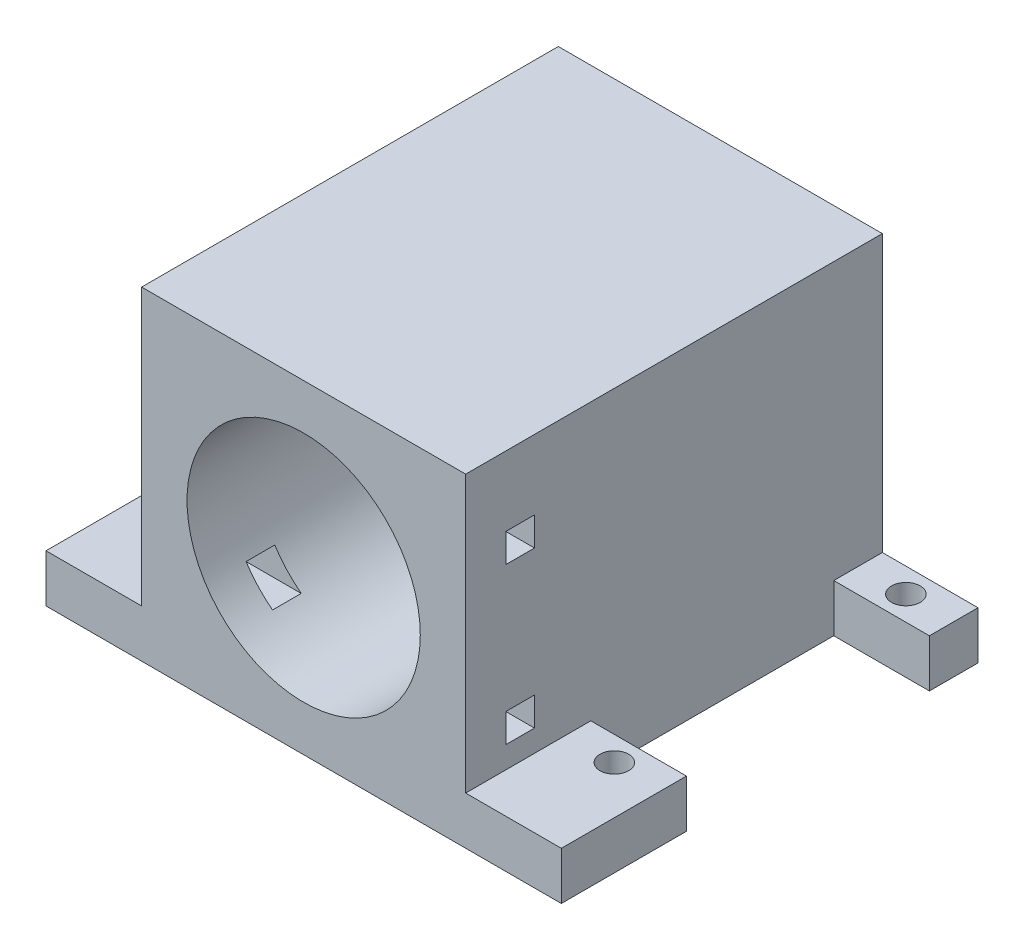
ISO-10303-21;
HEADER;
FILE_DESCRIPTION(('STEP AP214'),'2;1');
FILE_NAME('part.step','',(''),(''),'','','');
FILE_SCHEMA(('AUTOMOTIVE_DESIGN { 1 0 10303 214 1 1 1 1 }'));
ENDSEC;
DATA;
#1=APPLICATION_CONTEXT('core data for automotive mechanical design processes');
#2=APPLICATION_PROTOCOL_DEFINITION('international standard','automotive_design',2000,#1);
#3=PRODUCT_CONTEXT('',#1,'mechanical');
#4=PRODUCT('Part','Part','',(#3));
#5=PRODUCT_RELATED_PRODUCT_CATEGORY('part','',(#4));
#6=PRODUCT_DEFINITION_FORMATION('','',#4);
#7=PRODUCT_DEFINITION_CONTEXT('part definition',#1,'design');
#8=PRODUCT_DEFINITION('design','',#6,#7);
#9=PRODUCT_DEFINITION_SHAPE('','',#8);
#10=(LENGTH_UNIT() NAMED_UNIT(*) SI_UNIT(.MILLI.,.METRE.));
#11=(NAMED_UNIT(*) PLANE_ANGLE_UNIT() SI_UNIT($,.RADIAN.));
#12=(NAMED_UNIT(*) SI_UNIT($,.STERADIAN.) SOLID_ANGLE_UNIT());
#13=UNCERTAINTY_MEASURE_WITH_UNIT(LENGTH_MEASURE(1.E-05),#10,'distance_accuracy_value','');
#14=(GEOMETRIC_REPRESENTATION_CONTEXT(3) GLOBAL_UNCERTAINTY_ASSIGNED_CONTEXT((#13)) GLOBAL_UNIT_ASSIGNED_CONTEXT((#10,
#11,#12)) REPRESENTATION_CONTEXT('',''));
#15=CARTESIAN_POINT('',(0.,0.,0.));
#16=DIRECTION('',(0.,0.,1.));
#17=DIRECTION('',(1.,0.,0.));
#18=AXIS2_PLACEMENT_3D('',#15,#16,#17);
#19=CARTESIAN_POINT('',(0.,-11.938,17.78));
#20=DIRECTION('',(0.,1.,0.));
#21=DIRECTION('',(0.,0.,1.));
#22=AXIS2_PLACEMENT_3D('',#19,#20,#21);
#23=PLANE('',#22);
#24=CARTESIAN_POINT('',(-21.938,-11.938,-15.24));
#25=DIRECTION('',(0.,1.,0.));
#26=DIRECTION('',(0.,0.,1.));
#27=AXIS2_PLACEMENT_3D('',#24,#25,#26);
#28=CIRCLE('',#27,1.5);
#29=CARTESIAN_POINT('',(-21.938,-11.938,-13.74));
#30=VERTEX_POINT('',#29);
#31=EDGE_CURVE('E375',#30,#30,#28,.T.);
#32=ORIENTED_EDGE('',*,*,#31,.F.);
#33=EDGE_LOOP('',(#32));
#34=FACE_BOUND('',#33,.T.);
#35=DIRECTION('',(-1.,0.,0.));
#36=VECTOR('',#35,1.);
#37=CARTESIAN_POINT('',(-26.938,-11.938,-12.7));
#38=LINE('',#37,#36);
#39=CARTESIAN_POINT('',(-16.938,-11.938,-12.7));
#40=VERTEX_POINT('',#39);
#41=CARTESIAN_POINT('',(-26.938,-11.938,-12.7));
#42=VERTEX_POINT('',#41);
#43=EDGE_CURVE('E408',#40,#42,#38,.T.);
#44=ORIENTED_EDGE('',*,*,#43,.F.);
#45=DIRECTION('',(0.,0.,-1.));
#46=VECTOR('',#45,1.);
#47=CARTESIAN_POINT('',(-16.938,-11.938,17.78));
#48=LINE('',#47,#46);
#49=CARTESIAN_POINT('',(-16.938,-11.938,-17.78));
#50=VERTEX_POINT('',#49);
#51=EDGE_CURVE('E473',#40,#50,#48,.T.);
#52=ORIENTED_EDGE('',*,*,#51,.T.);
#53=DIRECTION('',(1.,0.,0.));
#54=VECTOR('',#53,1.);
#55=CARTESIAN_POINT('',(0.,-11.938,-17.78));
#56=LINE('',#55,#54);
#57=CARTESIAN_POINT('',(-26.938,-11.938,-17.78));
#58=VERTEX_POINT('',#57);
#59=EDGE_CURVE('E438',#58,#50,#56,.T.);
#60=ORIENTED_EDGE('',*,*,#59,.F.);
#61=DIRECTION('',(0.,0.,-1.));
#62=VECTOR('',#61,1.);
#63=CARTESIAN_POINT('',(-26.938,-11.938,17.78));
#64=LINE('',#63,#62);
#65=EDGE_CURVE('E469',#42,#58,#64,.T.);
#66=ORIENTED_EDGE('',*,*,#65,.F.);
#67=EDGE_LOOP('',(#44,#52,#60,#66));
#68=FACE_BOUND('',#67,.T.);
#69=ADVANCED_FACE('F36',(#34,#68),#23,.T.);
#70=CARTESIAN_POINT('',(-26.938,0.,17.78));
#71=DIRECTION('',(-1.,0.,0.));
#72=DIRECTION('',(0.,0.,1.));
#73=AXIS2_PLACEMENT_3D('',#70,#71,#72);
#74=PLANE('',#73);
#75=DIRECTION('',(0.,1.,0.));
#76=VECTOR('',#75,1.);
#77=CARTESIAN_POINT('',(-26.938,-16.939,-12.7));
#78=LINE('',#77,#76);
#79=CARTESIAN_POINT('',(-26.938,-16.938,-12.7));
#80=VERTEX_POINT('',#79);
#81=EDGE_CURVE('E411',#80,#42,#78,.T.);
#82=ORIENTED_EDGE('',*,*,#81,.T.);
#83=ORIENTED_EDGE('',*,*,#65,.T.);
#84=DIRECTION('',(0.,1.,0.));
#85=VECTOR('',#84,1.);
#86=CARTESIAN_POINT('',(-26.938,0.,-17.78));
#87=LINE('',#86,#85);
#88=CARTESIAN_POINT('',(-26.938,-16.938,-17.78));
#89=VERTEX_POINT('',#88);
#90=EDGE_CURVE('E441',#89,#58,#87,.T.);
#91=ORIENTED_EDGE('',*,*,#90,.F.);
#92=DIRECTION('',(0.,0.,-1.));
#93=VECTOR('',#92,1.);
#94=CARTESIAN_POINT('',(-26.938,-16.938,17.78));
#95=LINE('',#94,#93);
#96=EDGE_CURVE('E465',#80,#89,#95,.T.);
#97=ORIENTED_EDGE('',*,*,#96,.F.);
#98=EDGE_LOOP('',(#82,#83,#91,#97));
#99=FACE_BOUND('',#98,.T.);
#100=ADVANCED_FACE('F540',(#99),#74,.T.);
#101=CARTESIAN_POINT('',(26.938,0.,17.78));
#102=DIRECTION('',(1.,0.,0.));
#103=DIRECTION('',(0.,0.,-1.));
#104=AXIS2_PLACEMENT_3D('',#101,#102,#103);
#105=PLANE('',#104);
#106=DIRECTION('',(0.,1.,0.));
#107=VECTOR('',#106,1.);
#108=CARTESIAN_POINT('',(26.938,-16.939,-12.7));
#109=LINE('',#108,#107);
#110=CARTESIAN_POINT('',(26.938,-16.938,-12.7));
#111=VERTEX_POINT('',#110);
#112=CARTESIAN_POINT('',(26.938,-11.938,-12.7));
#113=VERTEX_POINT('',#112);
#114=EDGE_CURVE('E387',#111,#113,#109,.T.);
#115=ORIENTED_EDGE('',*,*,#114,.F.);
#116=DIRECTION('',(0.,0.,-1.));
#117=VECTOR('',#116,1.);
#118=CARTESIAN_POINT('',(26.938,-16.938,17.78));
#119=LINE('',#118,#117);
#120=CARTESIAN_POINT('',(26.938,-16.938,-17.78));
#121=VERTEX_POINT('',#120);
#122=EDGE_CURVE('E461',#111,#121,#119,.T.);
#123=ORIENTED_EDGE('',*,*,#122,.T.);
#124=DIRECTION('',(0.,-1.,0.));
#125=VECTOR('',#124,1.);
#126=CARTESIAN_POINT('',(26.938,0.,-17.78));
#127=LINE('',#126,#125);
#128=CARTESIAN_POINT('',(26.938,-11.938,-17.78));
#129=VERTEX_POINT('',#128);
#130=EDGE_CURVE('E447',#129,#121,#127,.T.);
#131=ORIENTED_EDGE('',*,*,#130,.F.);
#132=DIRECTION('',(0.,0.,-1.));
#133=VECTOR('',#132,1.);
#134=CARTESIAN_POINT('',(26.938,-11.938,17.78));
#135=LINE('',#134,#133);
#136=EDGE_CURVE('E457',#113,#129,#135,.T.);
#137=ORIENTED_EDGE('',*,*,#136,.F.);
#138=EDGE_LOOP('',(#115,#123,#131,#137));
#139=FACE_BOUND('',#138,.T.);
#140=ADVANCED_FACE('F547',(#139),#105,.T.);
#141=CARTESIAN_POINT('',(0.,-11.938,17.78));
#142=DIRECTION('',(0.,1.,0.));
#143=DIRECTION('',(0.,0.,1.));
#144=AXIS2_PLACEMENT_3D('',#141,#142,#143);
#145=PLANE('',#144);
#146=CARTESIAN_POINT('',(21.938,-11.938,-15.24));
#147=DIRECTION('',(0.,1.,0.));
#148=DIRECTION('',(0.,0.,-1.));
#149=AXIS2_PLACEMENT_3D('',#146,#147,#148);
#150=CIRCLE('',#149,1.5);
#151=CARTESIAN_POINT('',(21.938,-11.938,-16.74));
#152=VERTEX_POINT('',#151);
#153=EDGE_CURVE('E359',#152,#152,#150,.T.);
#154=ORIENTED_EDGE('',*,*,#153,.F.);
#155=EDGE_LOOP('',(#154));
#156=FACE_BOUND('',#155,.T.);
#157=DIRECTION('',(-1.,0.,0.));
#158=VECTOR('',#157,1.);
#159=CARTESIAN_POINT('',(16.938,-11.938,-12.7));
#160=LINE('',#159,#158);
#161=CARTESIAN_POINT('',(16.938,-11.938,-12.7));
#162=VERTEX_POINT('',#161);
#163=EDGE_CURVE('E380',#113,#162,#160,.T.);
#164=ORIENTED_EDGE('',*,*,#163,.F.);
#165=ORIENTED_EDGE('',*,*,#136,.T.);
#166=DIRECTION('',(1.,0.,0.));
#167=VECTOR('',#166,1.);
#168=CARTESIAN_POINT('',(0.,-11.938,-17.78));
#169=LINE('',#168,#167);
#170=CARTESIAN_POINT('',(16.938,-11.938,-17.78));
#171=VERTEX_POINT('',#170);
#172=EDGE_CURVE('E450',#171,#129,#169,.T.);
#173=ORIENTED_EDGE('',*,*,#172,.F.);
#174=DIRECTION('',(0.,0.,-1.));
#175=VECTOR('',#174,1.);
#176=CARTESIAN_POINT('',(16.938,-11.938,17.78));
#177=LINE('',#176,#175);
#178=EDGE_CURVE('E453',#162,#171,#177,.T.);
#179=ORIENTED_EDGE('',*,*,#178,.F.);
#180=EDGE_LOOP('',(#164,#165,#173,#179));
#181=FACE_BOUND('',#180,.T.);
#182=ADVANCED_FACE('F617',(#156,#181),#145,.T.);
#183=CARTESIAN_POINT('',(0.,0.,17.78));
#184=DIRECTION('',(0.,0.,-1.));
#185=DIRECTION('',(-1.,0.,0.));
#186=AXIS2_PLACEMENT_3D('',#183,#184,#185);
#187=CYLINDRICAL_SURFACE('',#186,3.5);
#188=CARTESIAN_POINT('',(0.,0.,-17.78));
#189=DIRECTION('',(0.,0.,1.));
#190=DIRECTION('',(1.,0.,0.));
#191=AXIS2_PLACEMENT_3D('',#188,#189,#190);
#192=CIRCLE('',#191,3.5);
#193=CARTESIAN_POINT('',(3.5,0.,-17.78));
#194=VERTEX_POINT('',#193);
#195=EDGE_CURVE('E426',#194,#194,#192,.T.);
#196=ORIENTED_EDGE('',*,*,#195,.F.);
#197=EDGE_LOOP('',(#196));
#198=FACE_BOUND('',#197,.T.);
#199=CARTESIAN_POINT('',(0.,0.,-15.24));
#200=DIRECTION('',(0.,0.,1.));
#201=DIRECTION('',(1.,0.,0.));
#202=AXIS2_PLACEMENT_3D('',#199,#200,#201);
#203=CIRCLE('',#202,3.5);
#204=CARTESIAN_POINT('',(3.5,0.,-15.24));
#205=VERTEX_POINT('',#204);
#206=EDGE_CURVE('E425',#205,#205,#203,.T.);
#207=ORIENTED_EDGE('',*,*,#206,.T.);
#208=EDGE_LOOP('',(#207));
#209=FACE_BOUND('',#208,.T.);
#210=ADVANCED_FACE('F38',(#198,#209),#187,.F.);
#211=CARTESIAN_POINT('',(16.938,0.,17.78));
#212=DIRECTION('',(1.,0.,0.));
#213=DIRECTION('',(0.,1.,0.));
#214=AXIS2_PLACEMENT_3D('',#211,#212,#213);
#215=PLANE('',#214);
#216=DIRECTION('',(0.,0.,-1.));
#217=VECTOR('',#216,1.);
#218=CARTESIAN_POINT('',(16.938,6.652,21.5876));
#219=LINE('',#218,#217);
#220=CARTESIAN_POINT('',(16.938,6.652,21.5876));
#221=VERTEX_POINT('',#220);
#222=CARTESIAN_POINT('',(16.938,6.652,18.5876));
#223=VERTEX_POINT('',#222);
#224=EDGE_CURVE('E921',#221,#223,#219,.T.);
#225=ORIENTED_EDGE('',*,*,#224,.F.);
#226=DIRECTION('',(0.,-1.,0.));
#227=VECTOR('',#226,1.);
#228=CARTESIAN_POINT('',(16.938,9.652,21.5876));
#229=LINE('',#228,#227);
#230=CARTESIAN_POINT('',(16.938,9.652,21.5876));
#231=VERTEX_POINT('',#230);
#232=EDGE_CURVE('E276',#231,#221,#229,.T.);
#233=ORIENTED_EDGE('',*,*,#232,.F.);
#234=DIRECTION('',(0.,0.,1.));
#235=VECTOR('',#234,1.);
#236=CARTESIAN_POINT('',(16.938,9.652,21.5876));
#237=LINE('',#236,#235);
#238=CARTESIAN_POINT('',(16.938,9.652,18.5876));
#239=VERTEX_POINT('',#238);
#240=EDGE_CURVE('E51',#239,#231,#237,.T.);
#241=ORIENTED_EDGE('',*,*,#240,.F.);
#242=DIRECTION('',(0.,1.,0.));
#243=VECTOR('',#242,1.);
#244=CARTESIAN_POINT('',(16.938,9.652,18.5876));
#245=LINE('',#244,#243);
#246=EDGE_CURVE('E272',#223,#239,#245,.T.);
#247=ORIENTED_EDGE('',*,*,#246,.F.);
#248=EDGE_LOOP('',(#225,#233,#241,#247));
#249=FACE_BOUND('',#248,.T.);
#250=DIRECTION('',(0.,0.,-1.));
#251=VECTOR('',#250,1.);
#252=CARTESIAN_POINT('',(16.938,-9.652,21.5876));
#253=LINE('',#252,#251);
#254=CARTESIAN_POINT('',(16.938,-9.652,21.5876));
#255=VERTEX_POINT('',#254);
#256=CARTESIAN_POINT('',(16.938,-9.652,18.5876));
#257=VERTEX_POINT('',#256);
#258=EDGE_CURVE('E294',#255,#257,#253,.T.);
#259=ORIENTED_EDGE('',*,*,#258,.F.);
#260=DIRECTION('',(0.,-1.,0.));
#261=VECTOR('',#260,1.);
#262=CARTESIAN_POINT('',(16.938,-6.65199999999999,21.5876));
#263=LINE('',#262,#261);
#264=CARTESIAN_POINT('',(16.938,-6.65199999999999,21.5876));
#265=VERTEX_POINT('',#264);
#266=EDGE_CURVE('E297',#265,#255,#263,.T.);
#267=ORIENTED_EDGE('',*,*,#266,.F.);
#268=DIRECTION('',(0.,0.,1.));
#269=VECTOR('',#268,1.);
#270=CARTESIAN_POINT('',(16.938,-6.65199999999999,21.5876));
#271=LINE('',#270,#269);
#272=CARTESIAN_POINT('',(16.938,-6.65199999999999,18.5876));
#273=VERTEX_POINT('',#272);
#274=EDGE_CURVE('E59',#273,#265,#271,.T.);
#275=ORIENTED_EDGE('',*,*,#274,.F.);
#276=DIRECTION('',(0.,1.,0.));
#277=VECTOR('',#276,1.);
#278=CARTESIAN_POINT('',(16.938,-6.65199999999999,18.5876));
#279=LINE('',#278,#277);
#280=EDGE_CURVE('E291',#257,#273,#279,.T.);
#281=ORIENTED_EDGE('',*,*,#280,.F.);
#282=EDGE_LOOP('',(#259,#267,#275,#281));
#283=FACE_BOUND('',#282,.T.);
#284=DIRECTION('',(0.,-1.,0.));
#285=VECTOR('',#284,1.);
#286=CARTESIAN_POINT('',(16.938,0.,-17.78));
#287=LINE('',#286,#285);
#288=CARTESIAN_POINT('',(16.938,16.938,-17.78));
#289=VERTEX_POINT('',#288);
#290=EDGE_CURVE('E429',#289,#171,#287,.T.);
#291=ORIENTED_EDGE('',*,*,#290,.F.);
#292=DIRECTION('',(0.,0.,-1.));
#293=VECTOR('',#292,1.);
#294=CARTESIAN_POINT('',(16.938,16.938,17.78));
#295=LINE('',#294,#293);
#296=CARTESIAN_POINT('',(16.938,16.938,25.78));
#297=VERTEX_POINT('',#296);
#298=EDGE_CURVE('E479',#297,#289,#295,.T.);
#299=ORIENTED_EDGE('',*,*,#298,.F.);
#300=DIRECTION('',(0.,1.,0.));
#301=VECTOR('',#300,1.);
#302=CARTESIAN_POINT('',(16.938,-11.938,25.78));
#303=LINE('',#302,#301);
#304=CARTESIAN_POINT('',(16.938,-11.938,25.78));
#305=VERTEX_POINT('',#304);
#306=EDGE_CURVE('E346',#305,#297,#303,.T.);
#307=ORIENTED_EDGE('',*,*,#306,.F.);
#308=CARTESIAN_POINT('',(16.938,-11.938,12.7));
#309=VERTEX_POINT('',#308);
#310=EDGE_CURVE('E454',#305,#309,#177,.T.);
#311=ORIENTED_EDGE('',*,*,#310,.T.);
#312=DIRECTION('',(0.,1.,0.));
#313=VECTOR('',#312,1.);
#314=CARTESIAN_POINT('',(16.938,-16.939,12.7));
#315=LINE('',#314,#313);
#316=CARTESIAN_POINT('',(16.938,-16.938,12.7));
#317=VERTEX_POINT('',#316);
#318=EDGE_CURVE('E383',#317,#309,#315,.T.);
#319=ORIENTED_EDGE('',*,*,#318,.F.);
#320=DIRECTION('',(0.,0.,1.));
#321=VECTOR('',#320,1.);
#322=CARTESIAN_POINT('',(16.938,-16.938,-12.7));
#323=LINE('',#322,#321);
#324=CARTESIAN_POINT('',(16.938,-16.938,-12.7));
#325=VERTEX_POINT('',#324);
#326=EDGE_CURVE('E371',#325,#317,#323,.T.);
#327=ORIENTED_EDGE('',*,*,#326,.F.);
#328=DIRECTION('',(0.,1.,0.));
#329=VECTOR('',#328,1.);
#330=CARTESIAN_POINT('',(16.938,-16.939,-12.7));
#331=LINE('',#330,#329);
#332=EDGE_CURVE('E384',#325,#162,#331,.T.);
#333=ORIENTED_EDGE('',*,*,#332,.T.);
#334=ORIENTED_EDGE('',*,*,#178,.T.);
#335=EDGE_LOOP('',(#291,#299,#307,#311,#319,#327,#333,#334));
#336=FACE_BOUND('',#335,.T.);
#337=ADVANCED_FACE('F587',(#249,#283,#336),#215,.T.);
#338=CARTESIAN_POINT('',(0.,16.938,17.78));
#339=DIRECTION('',(0.,1.,0.));
#340=DIRECTION('',(0.,0.,1.));
#341=AXIS2_PLACEMENT_3D('',#338,#339,#340);
#342=PLANE('',#341);
#343=DIRECTION('',(1.,0.,0.));
#344=VECTOR('',#343,1.);
#345=CARTESIAN_POINT('',(0.,16.938,-17.78));
#346=LINE('',#345,#344);
#347=CARTESIAN_POINT('',(-16.938,16.938,-17.78));
#348=VERTEX_POINT('',#347);
#349=EDGE_CURVE('E432',#348,#289,#346,.T.);
#350=ORIENTED_EDGE('',*,*,#349,.F.);
#351=DIRECTION('',(0.,0.,-1.));
#352=VECTOR('',#351,1.);
#353=CARTESIAN_POINT('',(-16.938,16.938,17.78));
#354=LINE('',#353,#352);
#355=CARTESIAN_POINT('',(-16.938,16.938,25.78));
#356=VERTEX_POINT('',#355);
#357=EDGE_CURVE('E477',#356,#348,#354,.T.);
#358=ORIENTED_EDGE('',*,*,#357,.F.);
#359=DIRECTION('',(-1.,0.,0.));
#360=VECTOR('',#359,1.);
#361=CARTESIAN_POINT('',(16.938,16.938,25.78));
#362=LINE('',#361,#360);
#363=EDGE_CURVE('E349',#297,#356,#362,.T.);
#364=ORIENTED_EDGE('',*,*,#363,.F.);
#365=ORIENTED_EDGE('',*,*,#298,.T.);
#366=EDGE_LOOP('',(#350,#358,#364,#365));
#367=FACE_BOUND('',#366,.T.);
#368=ADVANCED_FACE('F562',(#367),#342,.T.);
#369=CARTESIAN_POINT('',(-16.938,0.,17.78));
#370=DIRECTION('',(-1.,0.,0.));
#371=DIRECTION('',(0.,0.,1.));
#372=AXIS2_PLACEMENT_3D('',#369,#370,#371);
#373=PLANE('',#372);
#374=DIRECTION('',(0.,0.,-1.));
#375=VECTOR('',#374,1.);
#376=CARTESIAN_POINT('',(-16.938,6.652,21.5876));
#377=LINE('',#376,#375);
#378=CARTESIAN_POINT('',(-16.938,6.652,21.5876));
#379=VERTEX_POINT('',#378);
#380=CARTESIAN_POINT('',(-16.938,6.652,18.5876));
#381=VERTEX_POINT('',#380);
#382=EDGE_CURVE('E264',#379,#381,#377,.T.);
#383=ORIENTED_EDGE('',*,*,#382,.T.);
#384=DIRECTION('',(0.,1.,0.));
#385=VECTOR('',#384,1.);
#386=CARTESIAN_POINT('',(-16.938,9.65199999999999,18.5876));
#387=LINE('',#386,#385);
#388=CARTESIAN_POINT('',(-16.938,9.652,18.5876));
#389=VERTEX_POINT('',#388);
#390=EDGE_CURVE('E248',#381,#389,#387,.T.);
#391=ORIENTED_EDGE('',*,*,#390,.T.);
#392=DIRECTION('',(0.,0.,1.));
#393=VECTOR('',#392,1.);
#394=CARTESIAN_POINT('',(-16.938,9.652,21.5876));
#395=LINE('',#394,#393);
#396=CARTESIAN_POINT('',(-16.938,9.652,21.5876));
#397=VERTEX_POINT('',#396);
#398=EDGE_CURVE('E281',#389,#397,#395,.T.);
#399=ORIENTED_EDGE('',*,*,#398,.T.);
#400=DIRECTION('',(0.,-1.,0.));
#401=VECTOR('',#400,1.);
#402=CARTESIAN_POINT('',(-16.938,9.65199999999999,21.5876));
#403=LINE('',#402,#401);
#404=EDGE_CURVE('E270',#397,#379,#403,.T.);
#405=ORIENTED_EDGE('',*,*,#404,.T.);
#406=EDGE_LOOP('',(#383,#391,#399,#405));
#407=FACE_BOUND('',#406,.T.);
#408=DIRECTION('',(0.,0.,-1.));
#409=VECTOR('',#408,1.);
#410=CARTESIAN_POINT('',(-16.938,-9.652,21.5876));
#411=LINE('',#410,#409);
#412=CARTESIAN_POINT('',(-16.938,-9.652,21.5876));
#413=VERTEX_POINT('',#412);
#414=CARTESIAN_POINT('',(-16.938,-9.652,18.5876));
#415=VERTEX_POINT('',#414);
#416=EDGE_CURVE('E290',#413,#415,#411,.T.);
#417=ORIENTED_EDGE('',*,*,#416,.T.);
#418=DIRECTION('',(0.,1.,0.));
#419=VECTOR('',#418,1.);
#420=CARTESIAN_POINT('',(-16.938,-6.652,18.5876));
#421=LINE('',#420,#419);
#422=CARTESIAN_POINT('',(-16.938,-6.65199999999999,18.5876));
#423=VERTEX_POINT('',#422);
#424=EDGE_CURVE('E313',#415,#423,#421,.T.);
#425=ORIENTED_EDGE('',*,*,#424,.T.);
#426=DIRECTION('',(0.,0.,1.));
#427=VECTOR('',#426,1.);
#428=CARTESIAN_POINT('',(-16.938,-6.652,21.5876));
#429=LINE('',#428,#427);
#430=CARTESIAN_POINT('',(-16.938,-6.652,21.5876));
#431=VERTEX_POINT('',#430);
#432=EDGE_CURVE('E308',#423,#431,#429,.T.);
#433=ORIENTED_EDGE('',*,*,#432,.T.);
#434=DIRECTION('',(0.,-1.,0.));
#435=VECTOR('',#434,1.);
#436=CARTESIAN_POINT('',(-16.938,-6.652,21.5876));
#437=LINE('',#436,#435);
#438=EDGE_CURVE('E303',#431,#413,#437,.T.);
#439=ORIENTED_EDGE('',*,*,#438,.T.);
#440=EDGE_LOOP('',(#417,#425,#433,#439));
#441=FACE_BOUND('',#440,.T.);
#442=DIRECTION('',(0.,1.,0.));
#443=VECTOR('',#442,1.);
#444=CARTESIAN_POINT('',(-16.938,0.,-17.78));
#445=LINE('',#444,#443);
#446=EDGE_CURVE('E435',#50,#348,#445,.T.);
#447=ORIENTED_EDGE('',*,*,#446,.F.);
#448=ORIENTED_EDGE('',*,*,#51,.F.);
#449=DIRECTION('',(0.,1.,0.));
#450=VECTOR('',#449,1.);
#451=CARTESIAN_POINT('',(-16.938,-16.939,-12.7));
#452=LINE('',#451,#450);
#453=CARTESIAN_POINT('',(-16.938,-16.938,-12.7));
#454=VERTEX_POINT('',#453);
#455=EDGE_CURVE('E415',#454,#40,#452,.T.);
#456=ORIENTED_EDGE('',*,*,#455,.F.);
#457=DIRECTION('',(0.,0.,-1.));
#458=VECTOR('',#457,1.);
#459=CARTESIAN_POINT('',(-16.938,-16.938,-12.7));
#460=LINE('',#459,#458);
#461=CARTESIAN_POINT('',(-16.938,-16.938,12.7));
#462=VERTEX_POINT('',#461);
#463=EDGE_CURVE('E395',#462,#454,#460,.T.);
#464=ORIENTED_EDGE('',*,*,#463,.F.);
#465=DIRECTION('',(0.,1.,0.));
#466=VECTOR('',#465,1.);
#467=CARTESIAN_POINT('',(-16.938,-16.939,12.7));
#468=LINE('',#467,#466);
#469=CARTESIAN_POINT('',(-16.938,-11.938,12.7));
#470=VERTEX_POINT('',#469);
#471=EDGE_CURVE('E417',#462,#470,#468,.T.);
#472=ORIENTED_EDGE('',*,*,#471,.T.);
#473=CARTESIAN_POINT('',(-16.938,-11.938,25.78));
#474=VERTEX_POINT('',#473);
#475=EDGE_CURVE('E474',#474,#470,#48,.T.);
#476=ORIENTED_EDGE('',*,*,#475,.F.);
#477=DIRECTION('',(0.,-1.,0.));
#478=VECTOR('',#477,1.);
#479=CARTESIAN_POINT('',(-16.938,16.938,25.78));
#480=LINE('',#479,#478);
#481=EDGE_CURVE('E328',#356,#474,#480,.T.);
#482=ORIENTED_EDGE('',*,*,#481,.F.);
#483=ORIENTED_EDGE('',*,*,#357,.T.);
#484=EDGE_LOOP('',(#447,#448,#456,#464,#472,#476,#482,#483));
#485=FACE_BOUND('',#484,.T.);
#486=ADVANCED_FACE('F268',(#407,#441,#485),#373,.T.);
#487=CARTESIAN_POINT('',(-21.938,-11.938,15.24));
#488=DIRECTION('',(0.,1.,0.));
#489=DIRECTION('',(0.,0.,-1.));
#490=AXIS2_PLACEMENT_3D('',#487,#488,#489);
#491=CIRCLE('',#490,1.5);
#492=CARTESIAN_POINT('',(-21.938,-11.938,13.74));
#493=VERTEX_POINT('',#492);
#494=EDGE_CURVE('E353',#493,#493,#491,.T.);
#495=ORIENTED_EDGE('',*,*,#494,.F.);
#496=EDGE_LOOP('',(#495));
#497=FACE_BOUND('',#496,.T.);
#498=DIRECTION('',(1.,0.,0.));
#499=VECTOR('',#498,1.);
#500=CARTESIAN_POINT('',(-26.938,-11.938,12.7));
#501=LINE('',#500,#499);
#502=CARTESIAN_POINT('',(-26.938,-11.938,12.7));
#503=VERTEX_POINT('',#502);
#504=EDGE_CURVE('E405',#503,#470,#501,.T.);
#505=ORIENTED_EDGE('',*,*,#504,.F.);
#506=CARTESIAN_POINT('',(-26.938,-11.938,25.78));
#507=VERTEX_POINT('',#506);
#508=EDGE_CURVE('E470',#507,#503,#64,.T.);
#509=ORIENTED_EDGE('',*,*,#508,.F.);
#510=DIRECTION('',(-1.,0.,0.));
#511=VECTOR('',#510,1.);
#512=CARTESIAN_POINT('',(-16.938,-11.938,25.78));
#513=LINE('',#512,#511);
#514=EDGE_CURVE('E331',#474,#507,#513,.T.);
#515=ORIENTED_EDGE('',*,*,#514,.F.);
#516=ORIENTED_EDGE('',*,*,#475,.T.);
#517=EDGE_LOOP('',(#505,#509,#515,#516));
#518=FACE_BOUND('',#517,.T.);
#519=ADVANCED_FACE('F543',(#497,#518),#23,.T.);
#520=DIRECTION('',(0.,1.,0.));
#521=VECTOR('',#520,1.);
#522=CARTESIAN_POINT('',(-26.938,-16.939,12.7));
#523=LINE('',#522,#521);
#524=CARTESIAN_POINT('',(-26.938,-16.938,12.7));
#525=VERTEX_POINT('',#524);
#526=EDGE_CURVE('E410',#525,#503,#523,.T.);
#527=ORIENTED_EDGE('',*,*,#526,.F.);
#528=CARTESIAN_POINT('',(-26.938,-16.938,25.78));
#529=VERTEX_POINT('',#528);
#530=EDGE_CURVE('E466',#529,#525,#95,.T.);
#531=ORIENTED_EDGE('',*,*,#530,.F.);
#532=DIRECTION('',(0.,-1.,0.));
#533=VECTOR('',#532,1.);
#534=CARTESIAN_POINT('',(-26.938,-11.938,25.78));
#535=LINE('',#534,#533);
#536=EDGE_CURVE('E334',#507,#529,#535,.T.);
#537=ORIENTED_EDGE('',*,*,#536,.F.);
#538=ORIENTED_EDGE('',*,*,#508,.T.);
#539=EDGE_LOOP('',(#527,#531,#537,#538));
#540=FACE_BOUND('',#539,.T.);
#541=ADVANCED_FACE('F550',(#540),#74,.T.);
#542=CARTESIAN_POINT('',(0.,-16.938,17.78));
#543=DIRECTION('',(0.,-1.,0.));
#544=DIRECTION('',(0.,0.,-1.));
#545=AXIS2_PLACEMENT_3D('',#542,#543,#544);
#546=PLANE('',#545);
#547=CARTESIAN_POINT('',(21.938,-16.938,15.24));
#548=DIRECTION('',(0.,-1.,0.));
#549=DIRECTION('',(0.,0.,-1.));
#550=AXIS2_PLACEMENT_3D('',#547,#548,#549);
#551=CIRCLE('',#550,1.5);
#552=CARTESIAN_POINT('',(21.938,-16.938,13.74));
#553=VERTEX_POINT('',#552);
#554=EDGE_CURVE('E356',#553,#553,#551,.F.);
#555=ORIENTED_EDGE('',*,*,#554,.T.);
#556=EDGE_LOOP('',(#555));
#557=FACE_BOUND('',#556,.T.);
#558=CARTESIAN_POINT('',(21.938,-16.938,-15.24));
#559=DIRECTION('',(0.,-1.,0.));
#560=DIRECTION('',(0.,0.,-1.));
#561=AXIS2_PLACEMENT_3D('',#558,#559,#560);
#562=CIRCLE('',#561,1.5);
#563=CARTESIAN_POINT('',(21.938,-16.938,-16.74));
#564=VERTEX_POINT('',#563);
#565=EDGE_CURVE('E363',#564,#564,#562,.F.);
#566=ORIENTED_EDGE('',*,*,#565,.T.);
#567=EDGE_LOOP('',(#566));
#568=FACE_BOUND('',#567,.T.);
#569=CARTESIAN_POINT('',(-21.938,-16.938,-15.24));
#570=DIRECTION('',(0.,-1.,0.));
#571=DIRECTION('',(0.,0.,-1.));
#572=AXIS2_PLACEMENT_3D('',#569,#570,#571);
#573=CIRCLE('',#572,1.5);
#574=CARTESIAN_POINT('',(-21.938,-16.938,-16.74));
#575=VERTEX_POINT('',#574);
#576=EDGE_CURVE('E362',#575,#575,#573,.F.);
#577=ORIENTED_EDGE('',*,*,#576,.T.);
#578=EDGE_LOOP('',(#577));
#579=FACE_BOUND('',#578,.T.);
#580=DIRECTION('',(-1.,0.,0.));
#581=VECTOR('',#580,1.);
#582=CARTESIAN_POINT('',(16.938,-16.938,-12.7));
#583=LINE('',#582,#581);
#584=EDGE_CURVE('E374',#111,#325,#583,.T.);
#585=ORIENTED_EDGE('',*,*,#584,.T.);
#586=ORIENTED_EDGE('',*,*,#326,.T.);
#587=DIRECTION('',(1.,0.,0.));
#588=VECTOR('',#587,1.);
#589=CARTESIAN_POINT('',(16.938,-16.938,12.7));
#590=LINE('',#589,#588);
#591=CARTESIAN_POINT('',(26.938,-16.938,12.7));
#592=VERTEX_POINT('',#591);
#593=EDGE_CURVE('E386',#317,#592,#590,.T.);
#594=ORIENTED_EDGE('',*,*,#593,.T.);
#595=CARTESIAN_POINT('',(26.938,-16.938,25.78));
#596=VERTEX_POINT('',#595);
#597=EDGE_CURVE('E462',#596,#592,#119,.T.);
#598=ORIENTED_EDGE('',*,*,#597,.F.);
#599=DIRECTION('',(1.,0.,0.));
#600=VECTOR('',#599,1.);
#601=CARTESIAN_POINT('',(-26.938,-16.938,25.78));
#602=LINE('',#601,#600);
#603=EDGE_CURVE('E337',#529,#596,#602,.T.);
#604=ORIENTED_EDGE('',*,*,#603,.F.);
#605=ORIENTED_EDGE('',*,*,#530,.T.);
#606=DIRECTION('',(1.,0.,0.));
#607=VECTOR('',#606,1.);
#608=CARTESIAN_POINT('',(-26.938,-16.938,12.7));
#609=LINE('',#608,#607);
#610=EDGE_CURVE('E414',#525,#462,#609,.T.);
#611=ORIENTED_EDGE('',*,*,#610,.T.);
#612=ORIENTED_EDGE('',*,*,#463,.T.);
#613=DIRECTION('',(-1.,0.,0.));
#614=VECTOR('',#613,1.);
#615=CARTESIAN_POINT('',(-26.938,-16.938,-12.7));
#616=LINE('',#615,#614);
#617=EDGE_CURVE('E402',#454,#80,#616,.T.);
#618=ORIENTED_EDGE('',*,*,#617,.T.);
#619=ORIENTED_EDGE('',*,*,#96,.T.);
#620=DIRECTION('',(-1.,0.,0.));
#621=VECTOR('',#620,1.);
#622=CARTESIAN_POINT('',(0.,-16.938,-17.78));
#623=LINE('',#622,#621);
#624=EDGE_CURVE('E444',#121,#89,#623,.T.);
#625=ORIENTED_EDGE('',*,*,#624,.F.);
#626=ORIENTED_EDGE('',*,*,#122,.F.);
#627=EDGE_LOOP('',(#585,#586,#594,#598,#604,#605,#611,#612,#618,#619,#625,#626));
#628=FACE_BOUND('',#627,.T.);
#629=CARTESIAN_POINT('',(-21.938,-16.938,15.24));
#630=DIRECTION('',(0.,-1.,0.));
#631=DIRECTION('',(0.,0.,-1.));
#632=AXIS2_PLACEMENT_3D('',#629,#630,#631);
#633=CIRCLE('',#632,1.5);
#634=CARTESIAN_POINT('',(-21.938,-16.938,13.74));
#635=VERTEX_POINT('',#634);
#636=EDGE_CURVE('E352',#635,#635,#633,.F.);
#637=ORIENTED_EDGE('',*,*,#636,.T.);
#638=EDGE_LOOP('',(#637));
#639=FACE_BOUND('',#638,.T.);
#640=ADVANCED_FACE('F560',(#557,#568,#579,#628,#639),#546,.T.);
#641=DIRECTION('',(0.,1.,0.));
#642=VECTOR('',#641,1.);
#643=CARTESIAN_POINT('',(26.938,-16.939,12.7));
#644=LINE('',#643,#642);
#645=CARTESIAN_POINT('',(26.938,-11.938,12.7));
#646=VERTEX_POINT('',#645);
#647=EDGE_CURVE('E389',#592,#646,#644,.T.);
#648=ORIENTED_EDGE('',*,*,#647,.T.);
#649=CARTESIAN_POINT('',(26.938,-11.938,25.78));
#650=VERTEX_POINT('',#649);
#651=EDGE_CURVE('E458',#650,#646,#135,.T.);
#652=ORIENTED_EDGE('',*,*,#651,.F.);
#653=DIRECTION('',(0.,1.,0.));
#654=VECTOR('',#653,1.);
#655=CARTESIAN_POINT('',(26.938,-16.938,25.78));
#656=LINE('',#655,#654);
#657=EDGE_CURVE('E340',#596,#650,#656,.T.);
#658=ORIENTED_EDGE('',*,*,#657,.F.);
#659=ORIENTED_EDGE('',*,*,#597,.T.);
#660=EDGE_LOOP('',(#648,#652,#658,#659));
#661=FACE_BOUND('',#660,.T.);
#662=ADVANCED_FACE('F578',(#661),#105,.T.);
#663=CARTESIAN_POINT('',(21.938,-11.938,15.24));
#664=DIRECTION('',(0.,1.,0.));
#665=DIRECTION('',(0.,0.,1.));
#666=AXIS2_PLACEMENT_3D('',#663,#664,#665);
#667=CIRCLE('',#666,1.5);
#668=CARTESIAN_POINT('',(21.938,-11.938,16.74));
#669=VERTEX_POINT('',#668);
#670=EDGE_CURVE('E366',#669,#669,#667,.T.);
#671=ORIENTED_EDGE('',*,*,#670,.F.);
#672=EDGE_LOOP('',(#671));
#673=FACE_BOUND('',#672,.T.);
#674=DIRECTION('',(1.,0.,0.));
#675=VECTOR('',#674,1.);
#676=CARTESIAN_POINT('',(16.938,-11.938,12.7));
#677=LINE('',#676,#675);
#678=EDGE_CURVE('E378',#309,#646,#677,.T.);
#679=ORIENTED_EDGE('',*,*,#678,.F.);
#680=ORIENTED_EDGE('',*,*,#310,.F.);
#681=DIRECTION('',(-1.,0.,0.));
#682=VECTOR('',#681,1.);
#683=CARTESIAN_POINT('',(26.938,-11.938,25.78));
#684=LINE('',#683,#682);
#685=EDGE_CURVE('E343',#650,#305,#684,.T.);
#686=ORIENTED_EDGE('',*,*,#685,.F.);
#687=ORIENTED_EDGE('',*,*,#651,.T.);
#688=EDGE_LOOP('',(#679,#680,#686,#687));
#689=FACE_BOUND('',#688,.T.);
#690=ADVANCED_FACE('F583',(#673,#689),#145,.T.);
#691=CARTESIAN_POINT('',(0.,0.,-17.78));
#692=DIRECTION('',(0.,0.,1.));
#693=DIRECTION('',(1.,0.,0.));
#694=AXIS2_PLACEMENT_3D('',#691,#692,#693);
#695=PLANE('',#694);
#696=ORIENTED_EDGE('',*,*,#195,.T.);
#697=EDGE_LOOP('',(#696));
#698=FACE_BOUND('',#697,.T.);
#699=ORIENTED_EDGE('',*,*,#290,.T.);
#700=ORIENTED_EDGE('',*,*,#172,.T.);
#701=ORIENTED_EDGE('',*,*,#130,.T.);
#702=ORIENTED_EDGE('',*,*,#624,.T.);
#703=ORIENTED_EDGE('',*,*,#90,.T.);
#704=ORIENTED_EDGE('',*,*,#59,.T.);
#705=ORIENTED_EDGE('',*,*,#446,.T.);
#706=ORIENTED_EDGE('',*,*,#349,.T.);
#707=EDGE_LOOP('',(#699,#700,#701,#702,#703,#704,#705,#706));
#708=FACE_BOUND('',#707,.T.);
#709=ADVANCED_FACE('F605',(#698,#708),#695,.F.);
#710=CARTESIAN_POINT('',(0.,0.,-15.24));
#711=DIRECTION('',(0.,0.,1.));
#712=DIRECTION('',(1.,0.,0.));
#713=AXIS2_PLACEMENT_3D('',#710,#711,#712);
#714=CYLINDRICAL_SURFACE('',#713,12.192);
#715=CARTESIAN_POINT('',(0.,0.,18.5876));
#716=DIRECTION('',(0.,0.,-1.));
#717=DIRECTION('',(-1.,0.,0.));
#718=AXIS2_PLACEMENT_3D('',#715,#716,#717);
#719=CIRCLE('',#718,12.192);
#720=CARTESIAN_POINT('',(-7.44874217569651,9.652,18.5876));
#721=VERTEX_POINT('',#720);
#722=CARTESIAN_POINT('',(-10.2174243329716,6.652,18.5876));
#723=VERTEX_POINT('',#722);
#724=EDGE_CURVE('E44',#721,#723,#719,.F.);
#725=ORIENTED_EDGE('',*,*,#724,.T.);
#726=DIRECTION('',(0.,0.,1.));
#727=VECTOR('',#726,1.);
#728=CARTESIAN_POINT('',(-10.2174243329716,6.652,-15.24));
#729=LINE('',#728,#727);
#730=CARTESIAN_POINT('',(-10.2174243329716,6.652,21.5876));
#731=VERTEX_POINT('',#730);
#732=EDGE_CURVE('E11',#723,#731,#729,.T.);
#733=ORIENTED_EDGE('',*,*,#732,.T.);
#734=CARTESIAN_POINT('',(0.,0.,21.5876));
#735=DIRECTION('',(0.,0.,1.));
#736=DIRECTION('',(1.,0.,0.));
#737=AXIS2_PLACEMENT_3D('',#734,#735,#736);
#738=CIRCLE('',#737,12.192);
#739=CARTESIAN_POINT('',(-7.44874217569651,9.652,21.5876));
#740=VERTEX_POINT('',#739);
#741=EDGE_CURVE('E507',#731,#740,#738,.F.);
#742=ORIENTED_EDGE('',*,*,#741,.T.);
#743=DIRECTION('',(0.,0.,1.));
#744=VECTOR('',#743,1.);
#745=CARTESIAN_POINT('',(-7.44874217569651,9.652,-15.24));
#746=LINE('',#745,#744);
#747=EDGE_CURVE('E515',#740,#721,#746,.F.);
#748=ORIENTED_EDGE('',*,*,#747,.T.);
#749=EDGE_LOOP('',(#725,#733,#742,#748));
#750=FACE_BOUND('',#749,.T.);
#751=CARTESIAN_POINT('',(7.44874217569651,9.652,21.5876));
#752=VERTEX_POINT('',#751);
#753=CARTESIAN_POINT('',(10.2174243329716,6.652,21.5876));
#754=VERTEX_POINT('',#753);
#755=EDGE_CURVE('E503',#752,#754,#738,.F.);
#756=ORIENTED_EDGE('',*,*,#755,.T.);
#757=DIRECTION('',(0.,0.,1.));
#758=VECTOR('',#757,1.);
#759=CARTESIAN_POINT('',(10.2174243329716,6.652,-15.24));
#760=LINE('',#759,#758);
#761=CARTESIAN_POINT('',(10.2174243329716,6.652,18.5876));
#762=VERTEX_POINT('',#761);
#763=EDGE_CURVE('E513',#754,#762,#760,.F.);
#764=ORIENTED_EDGE('',*,*,#763,.T.);
#765=CARTESIAN_POINT('',(7.44874217569651,9.652,18.5876));
#766=VERTEX_POINT('',#765);
#767=EDGE_CURVE('E510',#762,#766,#719,.F.);
#768=ORIENTED_EDGE('',*,*,#767,.T.);
#769=DIRECTION('',(0.,0.,1.));
#770=VECTOR('',#769,1.);
#771=CARTESIAN_POINT('',(7.44874217569651,9.652,-15.24));
#772=LINE('',#771,#770);
#773=EDGE_CURVE('E506',#766,#752,#772,.T.);
#774=ORIENTED_EDGE('',*,*,#773,.T.);
#775=EDGE_LOOP('',(#756,#764,#768,#774));
#776=FACE_BOUND('',#775,.T.);
#777=CARTESIAN_POINT('',(0.,0.,21.5876));
#778=DIRECTION('',(0.,0.,1.));
#779=DIRECTION('',(1.,0.,0.));
#780=AXIS2_PLACEMENT_3D('',#777,#778,#779);
#781=CIRCLE('',#780,12.192);
#782=CARTESIAN_POINT('',(10.2174243329716,-6.65199999999999,21.5876));
#783=VERTEX_POINT('',#782);
#784=CARTESIAN_POINT('',(7.44874217569651,-9.652,21.5876));
#785=VERTEX_POINT('',#784);
#786=EDGE_CURVE('E487',#783,#785,#781,.F.);
#787=ORIENTED_EDGE('',*,*,#786,.T.);
#788=DIRECTION('',(0.,0.,1.));
#789=VECTOR('',#788,1.);
#790=CARTESIAN_POINT('',(7.44874217569651,-9.652,-15.24));
#791=LINE('',#790,#789);
#792=CARTESIAN_POINT('',(7.44874217569651,-9.652,18.5876));
#793=VERTEX_POINT('',#792);
#794=EDGE_CURVE('E500',#785,#793,#791,.F.);
#795=ORIENTED_EDGE('',*,*,#794,.T.);
#796=CARTESIAN_POINT('',(0.,0.,18.5876));
#797=DIRECTION('',(0.,0.,-1.));
#798=DIRECTION('',(-1.,0.,0.));
#799=AXIS2_PLACEMENT_3D('',#796,#797,#798);
#800=CIRCLE('',#799,12.192);
#801=CARTESIAN_POINT('',(10.2174243329716,-6.652,18.5876));
#802=VERTEX_POINT('',#801);
#803=EDGE_CURVE('E494',#793,#802,#800,.F.);
#804=ORIENTED_EDGE('',*,*,#803,.T.);
#805=DIRECTION('',(0.,0.,1.));
#806=VECTOR('',#805,1.);
#807=CARTESIAN_POINT('',(10.2174243329716,-6.65200000000001,-15.24));
#808=LINE('',#807,#806);
#809=EDGE_CURVE('E497',#802,#783,#808,.T.);
#810=ORIENTED_EDGE('',*,*,#809,.T.);
#811=EDGE_LOOP('',(#787,#795,#804,#810));
#812=FACE_BOUND('',#811,.T.);
#813=CARTESIAN_POINT('',(-10.2174243329716,-6.652,18.5876));
#814=VERTEX_POINT('',#813);
#815=CARTESIAN_POINT('',(-7.44874217569651,-9.652,18.5876));
#816=VERTEX_POINT('',#815);
#817=EDGE_CURVE('E490',#814,#816,#800,.F.);
#818=ORIENTED_EDGE('',*,*,#817,.T.);
#819=DIRECTION('',(0.,0.,1.));
#820=VECTOR('',#819,1.);
#821=CARTESIAN_POINT('',(-7.44874217569651,-9.652,-15.24));
#822=LINE('',#821,#820);
#823=CARTESIAN_POINT('',(-7.44874217569651,-9.652,21.5876));
#824=VERTEX_POINT('',#823);
#825=EDGE_CURVE('E493',#816,#824,#822,.T.);
#826=ORIENTED_EDGE('',*,*,#825,.T.);
#827=CARTESIAN_POINT('',(-10.2174243329716,-6.652,21.5876));
#828=VERTEX_POINT('',#827);
#829=EDGE_CURVE('E481',#824,#828,#781,.F.);
#830=ORIENTED_EDGE('',*,*,#829,.T.);
#831=DIRECTION('',(0.,0.,1.));
#832=VECTOR('',#831,1.);
#833=CARTESIAN_POINT('',(-10.2174243329716,-6.65200000000001,-15.24));
#834=LINE('',#833,#832);
#835=EDGE_CURVE('E486',#828,#814,#834,.F.);
#836=ORIENTED_EDGE('',*,*,#835,.T.);
#837=EDGE_LOOP('',(#818,#826,#830,#836));
#838=FACE_BOUND('',#837,.T.);
#839=CARTESIAN_POINT('',(0.,0.,-15.24));
#840=DIRECTION('',(0.,0.,1.));
#841=DIRECTION('',(1.,0.,0.));
#842=AXIS2_PLACEMENT_3D('',#839,#840,#841);
#843=CIRCLE('',#842,12.192);
#844=CARTESIAN_POINT('',(12.192,0.,-15.24));
#845=VERTEX_POINT('',#844);
#846=EDGE_CURVE('E422',#845,#845,#843,.T.);
#847=ORIENTED_EDGE('',*,*,#846,.F.);
#848=EDGE_LOOP('',(#847));
#849=FACE_BOUND('',#848,.T.);
#850=CARTESIAN_POINT('',(0.,0.,25.78));
#851=DIRECTION('',(0.,0.,1.));
#852=DIRECTION('',(1.,0.,0.));
#853=AXIS2_PLACEMENT_3D('',#850,#851,#852);
#854=CIRCLE('',#853,12.192);
#855=CARTESIAN_POINT('',(12.192,0.,25.78));
#856=VERTEX_POINT('',#855);
#857=EDGE_CURVE('E288',#856,#856,#854,.T.);
#858=ORIENTED_EDGE('',*,*,#857,.T.);
#859=EDGE_LOOP('',(#858));
#860=FACE_BOUND('',#859,.T.);
#861=ADVANCED_FACE('F520',(#750,#776,#812,#838,#849,#860),#714,.F.);
#862=CARTESIAN_POINT('',(0.,0.,-15.24));
#863=DIRECTION('',(0.,0.,1.));
#864=DIRECTION('',(1.,0.,0.));
#865=AXIS2_PLACEMENT_3D('',#862,#863,#864);
#866=PLANE('',#865);
#867=ORIENTED_EDGE('',*,*,#206,.F.);
#868=EDGE_LOOP('',(#867));
#869=FACE_BOUND('',#868,.T.);
#870=ORIENTED_EDGE('',*,*,#846,.T.);
#871=EDGE_LOOP('',(#870));
#872=FACE_BOUND('',#871,.T.);
#873=ADVANCED_FACE('F637',(#869,#872),#866,.T.);
#874=CARTESIAN_POINT('',(16.938,-16.939,-12.7));
#875=DIRECTION('',(0.,0.,-1.));
#876=DIRECTION('',(-1.,0.,0.));
#877=AXIS2_PLACEMENT_3D('',#874,#875,#876);
#878=PLANE('',#877);
#879=ORIENTED_EDGE('',*,*,#114,.T.);
#880=ORIENTED_EDGE('',*,*,#163,.T.);
#881=ORIENTED_EDGE('',*,*,#332,.F.);
#882=ORIENTED_EDGE('',*,*,#584,.F.);
#883=EDGE_LOOP('',(#879,#880,#881,#882));
#884=FACE_BOUND('',#883,.T.);
#885=ADVANCED_FACE('F613',(#884),#878,.F.);
#886=CARTESIAN_POINT('',(16.938,-16.939,12.7));
#887=DIRECTION('',(0.,0.,1.));
#888=DIRECTION('',(1.,0.,0.));
#889=AXIS2_PLACEMENT_3D('',#886,#887,#888);
#890=PLANE('',#889);
#891=ORIENTED_EDGE('',*,*,#318,.T.);
#892=ORIENTED_EDGE('',*,*,#678,.T.);
#893=ORIENTED_EDGE('',*,*,#647,.F.);
#894=ORIENTED_EDGE('',*,*,#593,.F.);
#895=EDGE_LOOP('',(#891,#892,#893,#894));
#896=FACE_BOUND('',#895,.T.);
#897=ADVANCED_FACE('F678',(#896),#890,.F.);
#898=CARTESIAN_POINT('',(21.938,-16.939,-15.24));
#899=DIRECTION('',(0.,1.,0.));
#900=DIRECTION('',(0.,0.,1.));
#901=AXIS2_PLACEMENT_3D('',#898,#899,#900);
#902=CYLINDRICAL_SURFACE('',#901,1.5);
#903=ORIENTED_EDGE('',*,*,#565,.F.);
#904=EDGE_LOOP('',(#903));
#905=FACE_BOUND('',#904,.T.);
#906=ORIENTED_EDGE('',*,*,#153,.T.);
#907=EDGE_LOOP('',(#906));
#908=FACE_BOUND('',#907,.T.);
#909=ADVANCED_FACE('F630',(#905,#908),#902,.F.);
#910=CARTESIAN_POINT('',(21.938,-16.939,15.24));
#911=DIRECTION('',(0.,1.,0.));
#912=DIRECTION('',(0.,0.,1.));
#913=AXIS2_PLACEMENT_3D('',#910,#911,#912);
#914=CYLINDRICAL_SURFACE('',#913,1.5);
#915=ORIENTED_EDGE('',*,*,#554,.F.);
#916=EDGE_LOOP('',(#915));
#917=FACE_BOUND('',#916,.T.);
#918=ORIENTED_EDGE('',*,*,#670,.T.);
#919=EDGE_LOOP('',(#918));
#920=FACE_BOUND('',#919,.T.);
#921=ADVANCED_FACE('F622',(#917,#920),#914,.F.);
#922=CARTESIAN_POINT('',(-26.938,-16.939,-12.7));
#923=DIRECTION('',(0.,0.,-1.));
#924=DIRECTION('',(-1.,0.,0.));
#925=AXIS2_PLACEMENT_3D('',#922,#923,#924);
#926=PLANE('',#925);
#927=ORIENTED_EDGE('',*,*,#455,.T.);
#928=ORIENTED_EDGE('',*,*,#43,.T.);
#929=ORIENTED_EDGE('',*,*,#81,.F.);
#930=ORIENTED_EDGE('',*,*,#617,.F.);
#931=EDGE_LOOP('',(#927,#928,#929,#930));
#932=FACE_BOUND('',#931,.T.);
#933=ADVANCED_FACE('F620',(#932),#926,.F.);
#934=CARTESIAN_POINT('',(-26.938,-16.939,12.7));
#935=DIRECTION('',(0.,0.,1.));
#936=DIRECTION('',(1.,0.,0.));
#937=AXIS2_PLACEMENT_3D('',#934,#935,#936);
#938=PLANE('',#937);
#939=ORIENTED_EDGE('',*,*,#526,.T.);
#940=ORIENTED_EDGE('',*,*,#504,.T.);
#941=ORIENTED_EDGE('',*,*,#471,.F.);
#942=ORIENTED_EDGE('',*,*,#610,.F.);
#943=EDGE_LOOP('',(#939,#940,#941,#942));
#944=FACE_BOUND('',#943,.T.);
#945=ADVANCED_FACE('F597',(#944),#938,.F.);
#946=CARTESIAN_POINT('',(-21.938,-16.939,15.24));
#947=DIRECTION('',(0.,1.,0.));
#948=DIRECTION('',(0.,0.,1.));
#949=AXIS2_PLACEMENT_3D('',#946,#947,#948);
#950=CYLINDRICAL_SURFACE('',#949,1.5);
#951=ORIENTED_EDGE('',*,*,#636,.F.);
#952=EDGE_LOOP('',(#951));
#953=FACE_BOUND('',#952,.T.);
#954=ORIENTED_EDGE('',*,*,#494,.T.);
#955=EDGE_LOOP('',(#954));
#956=FACE_BOUND('',#955,.T.);
#957=ADVANCED_FACE('F628',(#953,#956),#950,.F.);
#958=CARTESIAN_POINT('',(-21.938,-16.939,-15.24));
#959=DIRECTION('',(0.,1.,0.));
#960=DIRECTION('',(0.,0.,1.));
#961=AXIS2_PLACEMENT_3D('',#958,#959,#960);
#962=CYLINDRICAL_SURFACE('',#961,1.5);
#963=ORIENTED_EDGE('',*,*,#576,.F.);
#964=EDGE_LOOP('',(#963));
#965=FACE_BOUND('',#964,.T.);
#966=ORIENTED_EDGE('',*,*,#31,.T.);
#967=EDGE_LOOP('',(#966));
#968=FACE_BOUND('',#967,.T.);
#969=ADVANCED_FACE('F634',(#965,#968),#962,.F.);
#970=CARTESIAN_POINT('',(0.,0.,25.78));
#971=DIRECTION('',(0.,0.,-1.));
#972=DIRECTION('',(-1.,0.,0.));
#973=AXIS2_PLACEMENT_3D('',#970,#971,#972);
#974=PLANE('',#973);
#975=ORIENTED_EDGE('',*,*,#481,.T.);
#976=ORIENTED_EDGE('',*,*,#514,.T.);
#977=ORIENTED_EDGE('',*,*,#536,.T.);
#978=ORIENTED_EDGE('',*,*,#603,.T.);
#979=ORIENTED_EDGE('',*,*,#657,.T.);
#980=ORIENTED_EDGE('',*,*,#685,.T.);
#981=ORIENTED_EDGE('',*,*,#306,.T.);
#982=ORIENTED_EDGE('',*,*,#363,.T.);
#983=EDGE_LOOP('',(#975,#976,#977,#978,#979,#980,#981,#982));
#984=FACE_BOUND('',#983,.T.);
#985=ORIENTED_EDGE('',*,*,#857,.F.);
#986=EDGE_LOOP('',(#985));
#987=FACE_BOUND('',#986,.T.);
#988=ADVANCED_FACE('F572',(#984,#987),#974,.F.);
#989=CARTESIAN_POINT('',(-21.1806406871193,-6.652,21.5876));
#990=DIRECTION('',(0.,0.,1.));
#991=DIRECTION('',(1.,0.,0.));
#992=AXIS2_PLACEMENT_3D('',#989,#990,#991);
#993=PLANE('',#992);
#994=DIRECTION('',(1.,0.,0.));
#995=VECTOR('',#994,1.);
#996=CARTESIAN_POINT('',(-21.1806406871193,-9.652,21.5876));
#997=LINE('',#996,#995);
#998=EDGE_CURVE('E323',#413,#824,#997,.T.);
#999=ORIENTED_EDGE('',*,*,#998,.F.);
#1000=ORIENTED_EDGE('',*,*,#438,.F.);
#1001=DIRECTION('',(1.,0.,0.));
#1002=VECTOR('',#1001,1.);
#1003=CARTESIAN_POINT('',(-21.1806406871193,-6.652,21.5876));
#1004=LINE('',#1003,#1002);
#1005=EDGE_CURVE('E307',#431,#828,#1004,.T.);
#1006=ORIENTED_EDGE('',*,*,#1005,.T.);
#1007=ORIENTED_EDGE('',*,*,#829,.F.);
#1008=EDGE_LOOP('',(#999,#1000,#1006,#1007));
#1009=FACE_BOUND('',#1008,.T.);
#1010=ADVANCED_FACE('F667',(#1009),#993,.F.);
#1011=CARTESIAN_POINT('',(-21.1806406871193,-6.652,21.5876));
#1012=DIRECTION('',(0.,1.,0.));
#1013=DIRECTION('',(0.,0.,1.));
#1014=AXIS2_PLACEMENT_3D('',#1011,#1012,#1013);
#1015=PLANE('',#1014);
#1016=ORIENTED_EDGE('',*,*,#1005,.F.);
#1017=ORIENTED_EDGE('',*,*,#432,.F.);
#1018=DIRECTION('',(1.,0.,0.));
#1019=VECTOR('',#1018,1.);
#1020=CARTESIAN_POINT('',(-21.1806406871193,-6.652,18.5876));
#1021=LINE('',#1020,#1019);
#1022=EDGE_CURVE('E312',#423,#814,#1021,.T.);
#1023=ORIENTED_EDGE('',*,*,#1022,.T.);
#1024=ORIENTED_EDGE('',*,*,#835,.F.);
#1025=EDGE_LOOP('',(#1016,#1017,#1023,#1024));
#1026=FACE_BOUND('',#1025,.T.);
#1027=ADVANCED_FACE('F793',(#1026),#1015,.F.);
#1028=CARTESIAN_POINT('',(-21.1806406871193,-6.652,18.5876));
#1029=DIRECTION('',(0.,0.,-1.));
#1030=DIRECTION('',(-1.,0.,0.));
#1031=AXIS2_PLACEMENT_3D('',#1028,#1029,#1030);
#1032=PLANE('',#1031);
#1033=ORIENTED_EDGE('',*,*,#1022,.F.);
#1034=ORIENTED_EDGE('',*,*,#424,.F.);
#1035=DIRECTION('',(1.,0.,0.));
#1036=VECTOR('',#1035,1.);
#1037=CARTESIAN_POINT('',(-21.1806406871193,-9.652,18.5876));
#1038=LINE('',#1037,#1036);
#1039=EDGE_CURVE('E317',#415,#816,#1038,.T.);
#1040=ORIENTED_EDGE('',*,*,#1039,.T.);
#1041=ORIENTED_EDGE('',*,*,#817,.F.);
#1042=EDGE_LOOP('',(#1033,#1034,#1040,#1041));
#1043=FACE_BOUND('',#1042,.T.);
#1044=ADVANCED_FACE('F804',(#1043),#1032,.F.);
#1045=CARTESIAN_POINT('',(-21.1806406871193,-9.652,21.5876));
#1046=DIRECTION('',(0.,-1.,0.));
#1047=DIRECTION('',(1.,0.,0.));
#1048=AXIS2_PLACEMENT_3D('',#1045,#1046,#1047);
#1049=PLANE('',#1048);
#1050=ORIENTED_EDGE('',*,*,#1039,.F.);
#1051=ORIENTED_EDGE('',*,*,#416,.F.);
#1052=ORIENTED_EDGE('',*,*,#998,.T.);
#1053=ORIENTED_EDGE('',*,*,#825,.F.);
#1054=EDGE_LOOP('',(#1050,#1051,#1052,#1053));
#1055=FACE_BOUND('',#1054,.T.);
#1056=ADVANCED_FACE('F815',(#1055),#1049,.F.);
#1057=EDGE_CURVE('E306',#785,#255,#997,.T.);
#1058=ORIENTED_EDGE('',*,*,#1057,.T.);
#1059=ORIENTED_EDGE('',*,*,#258,.T.);
#1060=EDGE_CURVE('E302',#793,#257,#1038,.T.);
#1061=ORIENTED_EDGE('',*,*,#1060,.F.);
#1062=ORIENTED_EDGE('',*,*,#794,.F.);
#1063=EDGE_LOOP('',(#1058,#1059,#1061,#1062));
#1064=FACE_BOUND('',#1063,.T.);
#1065=ADVANCED_FACE('F826',(#1064),#1049,.F.);
#1066=ORIENTED_EDGE('',*,*,#1060,.T.);
#1067=ORIENTED_EDGE('',*,*,#280,.T.);
#1068=EDGE_CURVE('E316',#802,#273,#1021,.T.);
#1069=ORIENTED_EDGE('',*,*,#1068,.F.);
#1070=ORIENTED_EDGE('',*,*,#803,.F.);
#1071=EDGE_LOOP('',(#1066,#1067,#1069,#1070));
#1072=FACE_BOUND('',#1071,.T.);
#1073=ADVANCED_FACE('F818',(#1072),#1032,.F.);
#1074=ORIENTED_EDGE('',*,*,#1068,.T.);
#1075=ORIENTED_EDGE('',*,*,#274,.T.);
#1076=EDGE_CURVE('E311',#783,#265,#1004,.T.);
#1077=ORIENTED_EDGE('',*,*,#1076,.F.);
#1078=ORIENTED_EDGE('',*,*,#809,.F.);
#1079=EDGE_LOOP('',(#1074,#1075,#1077,#1078));
#1080=FACE_BOUND('',#1079,.T.);
#1081=ADVANCED_FACE('F807',(#1080),#1015,.F.);
#1082=ORIENTED_EDGE('',*,*,#1076,.T.);
#1083=ORIENTED_EDGE('',*,*,#266,.T.);
#1084=ORIENTED_EDGE('',*,*,#1057,.F.);
#1085=ORIENTED_EDGE('',*,*,#786,.F.);
#1086=EDGE_LOOP('',(#1082,#1083,#1084,#1085));
#1087=FACE_BOUND('',#1086,.T.);
#1088=ADVANCED_FACE('F796',(#1087),#993,.F.);
#1089=CARTESIAN_POINT('',(-21.1806406871193,9.65199999999999,21.5876));
#1090=DIRECTION('',(0.,0.,1.));
#1091=DIRECTION('',(1.,0.,0.));
#1092=AXIS2_PLACEMENT_3D('',#1089,#1090,#1091);
#1093=PLANE('',#1092);
#1094=DIRECTION('',(1.,0.,0.));
#1095=VECTOR('',#1094,1.);
#1096=CARTESIAN_POINT('',(-21.1806406871193,9.65199999999999,21.5876));
#1097=LINE('',#1096,#1095);
#1098=EDGE_CURVE('E282',#752,#231,#1097,.T.);
#1099=ORIENTED_EDGE('',*,*,#1098,.T.);
#1100=ORIENTED_EDGE('',*,*,#232,.T.);
#1101=DIRECTION('',(1.,0.,0.));
#1102=VECTOR('',#1101,1.);
#1103=CARTESIAN_POINT('',(-21.1806406871193,6.65199999999999,21.5876));
#1104=LINE('',#1103,#1102);
#1105=EDGE_CURVE('E279',#754,#221,#1104,.T.);
#1106=ORIENTED_EDGE('',*,*,#1105,.F.);
#1107=ORIENTED_EDGE('',*,*,#755,.F.);
#1108=EDGE_LOOP('',(#1099,#1100,#1106,#1107));
#1109=FACE_BOUND('',#1108,.T.);
#1110=ADVANCED_FACE('F535',(#1109),#1093,.F.);
#1111=CARTESIAN_POINT('',(-21.1806406871193,9.65199999999999,21.5876));
#1112=DIRECTION('',(0.,1.,0.));
#1113=DIRECTION('',(-1.,0.,0.));
#1114=AXIS2_PLACEMENT_3D('',#1111,#1112,#1113);
#1115=PLANE('',#1114);
#1116=DIRECTION('',(1.,0.,0.));
#1117=VECTOR('',#1116,1.);
#1118=CARTESIAN_POINT('',(-21.1806406871193,9.65199999999999,18.5876));
#1119=LINE('',#1118,#1117);
#1120=EDGE_CURVE('E258',#766,#239,#1119,.T.);
#1121=ORIENTED_EDGE('',*,*,#1120,.T.);
#1122=ORIENTED_EDGE('',*,*,#240,.T.);
#1123=ORIENTED_EDGE('',*,*,#1098,.F.);
#1124=ORIENTED_EDGE('',*,*,#773,.F.);
#1125=EDGE_LOOP('',(#1121,#1122,#1123,#1124));
#1126=FACE_BOUND('',#1125,.T.);
#1127=ADVANCED_FACE('F529',(#1126),#1115,.F.);
#1128=CARTESIAN_POINT('',(-21.1806406871193,9.65199999999999,18.5876));
#1129=DIRECTION('',(0.,0.,-1.));
#1130=DIRECTION('',(-1.,0.,0.));
#1131=AXIS2_PLACEMENT_3D('',#1128,#1129,#1130);
#1132=PLANE('',#1131);
#1133=DIRECTION('',(1.,0.,0.));
#1134=VECTOR('',#1133,1.);
#1135=CARTESIAN_POINT('',(-21.1806406871193,6.65199999999999,18.5876));
#1136=LINE('',#1135,#1134);
#1137=EDGE_CURVE('E266',#762,#223,#1136,.T.);
#1138=ORIENTED_EDGE('',*,*,#1137,.T.);
#1139=ORIENTED_EDGE('',*,*,#246,.T.);
#1140=ORIENTED_EDGE('',*,*,#1120,.F.);
#1141=ORIENTED_EDGE('',*,*,#767,.F.);
#1142=EDGE_LOOP('',(#1138,#1139,#1140,#1141));
#1143=FACE_BOUND('',#1142,.T.);
#1144=ADVANCED_FACE('F537',(#1143),#1132,.F.);
#1145=CARTESIAN_POINT('',(-21.1806406871193,6.65199999999999,21.5876));
#1146=DIRECTION('',(0.,-1.,0.));
#1147=DIRECTION('',(1.,0.,0.));
#1148=AXIS2_PLACEMENT_3D('',#1145,#1146,#1147);
#1149=PLANE('',#1148);
#1150=ORIENTED_EDGE('',*,*,#1105,.T.);
#1151=ORIENTED_EDGE('',*,*,#224,.T.);
#1152=ORIENTED_EDGE('',*,*,#1137,.F.);
#1153=ORIENTED_EDGE('',*,*,#763,.F.);
#1154=EDGE_LOOP('',(#1150,#1151,#1152,#1153));
#1155=FACE_BOUND('',#1154,.T.);
#1156=ADVANCED_FACE('F880',(#1155),#1149,.F.);
#1157=EDGE_CURVE('E251',#381,#723,#1136,.T.);
#1158=ORIENTED_EDGE('',*,*,#1157,.F.);
#1159=ORIENTED_EDGE('',*,*,#382,.F.);
#1160=EDGE_CURVE('E286',#379,#731,#1104,.T.);
#1161=ORIENTED_EDGE('',*,*,#1160,.T.);
#1162=ORIENTED_EDGE('',*,*,#732,.F.);
#1163=EDGE_LOOP('',(#1158,#1159,#1161,#1162));
#1164=FACE_BOUND('',#1163,.T.);
#1165=ADVANCED_FACE('F262',(#1164),#1149,.F.);
#1166=EDGE_CURVE('E254',#389,#721,#1119,.T.);
#1167=ORIENTED_EDGE('',*,*,#1166,.F.);
#1168=ORIENTED_EDGE('',*,*,#390,.F.);
#1169=ORIENTED_EDGE('',*,*,#1157,.T.);
#1170=ORIENTED_EDGE('',*,*,#724,.F.);
#1171=EDGE_LOOP('',(#1167,#1168,#1169,#1170));
#1172=FACE_BOUND('',#1171,.T.);
#1173=ADVANCED_FACE('F250',(#1172),#1132,.F.);
#1174=EDGE_CURVE('E280',#397,#740,#1097,.T.);
#1175=ORIENTED_EDGE('',*,*,#1174,.F.);
#1176=ORIENTED_EDGE('',*,*,#398,.F.);
#1177=ORIENTED_EDGE('',*,*,#1166,.T.);
#1178=ORIENTED_EDGE('',*,*,#747,.F.);
#1179=EDGE_LOOP('',(#1175,#1176,#1177,#1178));
#1180=FACE_BOUND('',#1179,.T.);
#1181=ADVANCED_FACE('F526',(#1180),#1115,.F.);
#1182=ORIENTED_EDGE('',*,*,#1160,.F.);
#1183=ORIENTED_EDGE('',*,*,#404,.F.);
#1184=ORIENTED_EDGE('',*,*,#1174,.T.);
#1185=ORIENTED_EDGE('',*,*,#741,.F.);
#1186=EDGE_LOOP('',(#1182,#1183,#1184,#1185));
#1187=FACE_BOUND('',#1186,.T.);
#1188=ADVANCED_FACE('F523',(#1187),#1093,.F.);
#1189=CLOSED_SHELL('',(#69,#100,#140,#182,#210,#337,#368,#486,#519,#541,#640,#662,#690,#709,
#861,#873,#885,#897,#909,#921,#933,#945,#957,#969,#988,#1010,#1027,#1044,#1056,#1065,#1073,
#1081,#1088,#1110,#1127,#1144,#1156,#1165,#1173,#1181,#1188));
#1190=MANIFOLD_SOLID_BREP('B2',#1189);
#1191=ADVANCED_BREP_SHAPE_REPRESENTATION('',(#18,#1190),#14);
#1192=SHAPE_DEFINITION_REPRESENTATION(#9,#1191);
ENDSEC;
END-ISO-10303-21;
